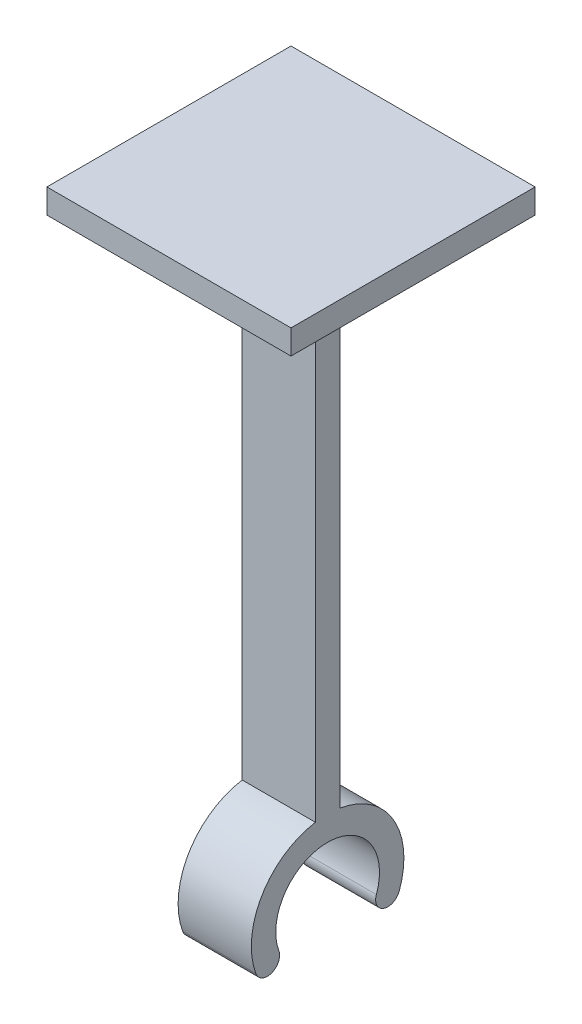
ISO-10303-21;
HEADER;
FILE_DESCRIPTION(('STEP AP214'),'2;1');
FILE_NAME('part.step','',(''),(''),'','','');
FILE_SCHEMA(('AUTOMOTIVE_DESIGN { 1 0 10303 214 1 1 1 1 }'));
ENDSEC;
DATA;
#1=APPLICATION_CONTEXT('core data for automotive mechanical design processes');
#2=APPLICATION_PROTOCOL_DEFINITION('international standard','automotive_design',2000,#1);
#3=PRODUCT_CONTEXT('',#1,'mechanical');
#4=PRODUCT('Part','Part','',(#3));
#5=PRODUCT_RELATED_PRODUCT_CATEGORY('part','',(#4));
#6=PRODUCT_DEFINITION_FORMATION('','',#4);
#7=PRODUCT_DEFINITION_CONTEXT('part definition',#1,'design');
#8=PRODUCT_DEFINITION('design','',#6,#7);
#9=PRODUCT_DEFINITION_SHAPE('','',#8);
#10=(LENGTH_UNIT() NAMED_UNIT(*) SI_UNIT(.MILLI.,.METRE.));
#11=(NAMED_UNIT(*) PLANE_ANGLE_UNIT() SI_UNIT($,.RADIAN.));
#12=(NAMED_UNIT(*) SI_UNIT($,.STERADIAN.) SOLID_ANGLE_UNIT());
#13=UNCERTAINTY_MEASURE_WITH_UNIT(LENGTH_MEASURE(1.E-05),#10,'distance_accuracy_value','');
#14=(GEOMETRIC_REPRESENTATION_CONTEXT(3) GLOBAL_UNCERTAINTY_ASSIGNED_CONTEXT((#13)) GLOBAL_UNIT_ASSIGNED_CONTEXT((#10,
#11,#12)) REPRESENTATION_CONTEXT('',''));
#15=CARTESIAN_POINT('',(0.,0.,0.));
#16=DIRECTION('',(0.,0.,1.));
#17=DIRECTION('',(1.,0.,0.));
#18=AXIS2_PLACEMENT_3D('',#15,#16,#17);
#19=CARTESIAN_POINT('',(3.,0.,0.));
#20=DIRECTION('',(-1.,0.,0.));
#21=DIRECTION('',(0.,0.,1.));
#22=AXIS2_PLACEMENT_3D('',#19,#20,#21);
#23=CYLINDRICAL_SURFACE('',#22,6.25);
#24=CARTESIAN_POINT('',(-3.,0.,0.));
#25=DIRECTION('',(1.,0.,0.));
#26=DIRECTION('',(0.,0.,-1.));
#27=AXIS2_PLACEMENT_3D('',#24,#25,#26);
#28=CIRCLE('',#27,6.25);
#29=CARTESIAN_POINT('',(-3.,-2.13762589578543,-5.87307887991193));
#30=VERTEX_POINT('',#29);
#31=CARTESIAN_POINT('',(-3.,6.16948133962653,-1.));
#32=VERTEX_POINT('',#31);
#33=EDGE_CURVE('E206',#30,#32,#28,.T.);
#34=ORIENTED_EDGE('',*,*,#33,.T.);
#35=DIRECTION('',(-1.,0.,0.));
#36=VECTOR('',#35,1.);
#37=CARTESIAN_POINT('',(3.,6.16948133962653,-1.));
#38=LINE('',#37,#36);
#39=CARTESIAN_POINT('',(3.,6.16948133962653,-1.));
#40=VERTEX_POINT('',#39);
#41=EDGE_CURVE('E65',#40,#32,#38,.T.);
#42=ORIENTED_EDGE('',*,*,#41,.F.);
#43=CARTESIAN_POINT('',(3.,0.,0.));
#44=DIRECTION('',(1.,0.,0.));
#45=DIRECTION('',(0.,0.,-1.));
#46=AXIS2_PLACEMENT_3D('',#43,#44,#45);
#47=CIRCLE('',#46,6.25);
#48=CARTESIAN_POINT('',(3.,-2.13762589578543,-5.87307887991193));
#49=VERTEX_POINT('',#48);
#50=EDGE_CURVE('E221',#49,#40,#47,.T.);
#51=ORIENTED_EDGE('',*,*,#50,.F.);
#52=DIRECTION('',(-1.,0.,0.));
#53=VECTOR('',#52,1.);
#54=CARTESIAN_POINT('',(3.,-2.13762589578543,-5.87307887991193));
#55=LINE('',#54,#53);
#56=EDGE_CURVE('E50',#49,#30,#55,.T.);
#57=ORIENTED_EDGE('',*,*,#56,.T.);
#58=EDGE_LOOP('',(#34,#42,#51,#57));
#59=FACE_BOUND('',#58,.T.);
#60=ADVANCED_FACE('F41',(#59),#23,.T.);
#61=DIRECTION('',(-1.,0.,0.));
#62=VECTOR('',#61,1.);
#63=CARTESIAN_POINT('',(3.,6.16948133962653,1.));
#64=LINE('',#63,#62);
#65=CARTESIAN_POINT('',(3.,6.16948133962653,1.));
#66=VERTEX_POINT('',#65);
#67=CARTESIAN_POINT('',(-3.,6.16948133962653,0.999999999999995));
#68=VERTEX_POINT('',#67);
#69=EDGE_CURVE('E57',#66,#68,#64,.T.);
#70=ORIENTED_EDGE('',*,*,#69,.T.);
#71=CARTESIAN_POINT('',(-3.,-2.13762589578543,5.87307887991193));
#72=VERTEX_POINT('',#71);
#73=EDGE_CURVE('E205',#68,#72,#28,.T.);
#74=ORIENTED_EDGE('',*,*,#73,.T.);
#75=DIRECTION('',(-1.,0.,0.));
#76=VECTOR('',#75,1.);
#77=CARTESIAN_POINT('',(3.,-2.13762589578543,5.87307887991193));
#78=LINE('',#77,#76);
#79=CARTESIAN_POINT('',(3.,-2.13762589578543,5.87307887991193));
#80=VERTEX_POINT('',#79);
#81=EDGE_CURVE('E233',#80,#72,#78,.T.);
#82=ORIENTED_EDGE('',*,*,#81,.F.);
#83=EDGE_CURVE('E220',#66,#80,#47,.T.);
#84=ORIENTED_EDGE('',*,*,#83,.F.);
#85=EDGE_LOOP('',(#70,#74,#82,#84));
#86=FACE_BOUND('',#85,.T.);
#87=ADVANCED_FACE('F266',(#86),#23,.T.);
#88=CARTESIAN_POINT('',(3.,0.,0.));
#89=DIRECTION('',(-1.,0.,0.));
#90=DIRECTION('',(0.,0.,1.));
#91=AXIS2_PLACEMENT_3D('',#88,#89,#90);
#92=CYLINDRICAL_SURFACE('',#91,4.25);
#93=DIRECTION('',(-1.,0.,0.));
#94=VECTOR('',#93,1.);
#95=CARTESIAN_POINT('',(3.,-1.4535856091341,3.99369363834011));
#96=LINE('',#95,#94);
#97=CARTESIAN_POINT('',(3.,-1.4535856091341,3.99369363834011));
#98=VERTEX_POINT('',#97);
#99=CARTESIAN_POINT('',(-3.,-1.4535856091341,3.99369363834011));
#100=VERTEX_POINT('',#99);
#101=EDGE_CURVE('E229',#98,#100,#96,.T.);
#102=ORIENTED_EDGE('',*,*,#101,.T.);
#103=CARTESIAN_POINT('',(-3.,0.,0.));
#104=DIRECTION('',(1.,0.,0.));
#105=DIRECTION('',(0.,0.,-1.));
#106=AXIS2_PLACEMENT_3D('',#103,#104,#105);
#107=CIRCLE('',#106,4.25);
#108=CARTESIAN_POINT('',(-3.,-1.4535856091341,-3.99369363834011));
#109=VERTEX_POINT('',#108);
#110=EDGE_CURVE('E198',#109,#100,#107,.T.);
#111=ORIENTED_EDGE('',*,*,#110,.F.);
#112=DIRECTION('',(-1.,0.,0.));
#113=VECTOR('',#112,1.);
#114=CARTESIAN_POINT('',(3.,-1.4535856091341,-3.99369363834011));
#115=LINE('',#114,#113);
#116=CARTESIAN_POINT('',(3.,-1.4535856091341,-3.99369363834011));
#117=VERTEX_POINT('',#116);
#118=EDGE_CURVE('E11',#117,#109,#115,.T.);
#119=ORIENTED_EDGE('',*,*,#118,.F.);
#120=CARTESIAN_POINT('',(3.,0.,0.));
#121=DIRECTION('',(1.,0.,0.));
#122=DIRECTION('',(0.,0.,-1.));
#123=AXIS2_PLACEMENT_3D('',#120,#121,#122);
#124=CIRCLE('',#123,4.25);
#125=EDGE_CURVE('E213',#117,#98,#124,.T.);
#126=ORIENTED_EDGE('',*,*,#125,.T.);
#127=EDGE_LOOP('',(#102,#111,#119,#126));
#128=FACE_BOUND('',#127,.T.);
#129=ADVANCED_FACE('F43',(#128),#92,.F.);
#130=CARTESIAN_POINT('',(3.,-1.79560575245977,-4.93338625912602));
#131=DIRECTION('',(-1.,0.,0.));
#132=DIRECTION('',(0.,0.,1.));
#133=AXIS2_PLACEMENT_3D('',#130,#131,#132);
#134=CYLINDRICAL_SURFACE('',#133,1.);
#135=ORIENTED_EDGE('',*,*,#118,.T.);
#136=CARTESIAN_POINT('',(-3.,-1.79560575245977,-4.93338625912602));
#137=DIRECTION('',(1.,0.,0.));
#138=DIRECTION('',(0.,0.,-1.));
#139=AXIS2_PLACEMENT_3D('',#136,#137,#138);
#140=CIRCLE('',#139,1.);
#141=EDGE_CURVE('E201',#30,#109,#140,.F.);
#142=ORIENTED_EDGE('',*,*,#141,.F.);
#143=ORIENTED_EDGE('',*,*,#56,.F.);
#144=CARTESIAN_POINT('',(3.,-1.79560575245977,-4.93338625912602));
#145=DIRECTION('',(1.,0.,0.));
#146=DIRECTION('',(0.,0.,-1.));
#147=AXIS2_PLACEMENT_3D('',#144,#145,#146);
#148=CIRCLE('',#147,1.);
#149=EDGE_CURVE('E216',#49,#117,#148,.F.);
#150=ORIENTED_EDGE('',*,*,#149,.T.);
#151=EDGE_LOOP('',(#135,#142,#143,#150));
#152=FACE_BOUND('',#151,.T.);
#153=ADVANCED_FACE('F243',(#152),#134,.T.);
#154=CARTESIAN_POINT('',(3.,-1.79560575245977,4.93338625912602));
#155=DIRECTION('',(-1.,0.,0.));
#156=DIRECTION('',(0.,0.,1.));
#157=AXIS2_PLACEMENT_3D('',#154,#155,#156);
#158=CYLINDRICAL_SURFACE('',#157,1.);
#159=ORIENTED_EDGE('',*,*,#81,.T.);
#160=CARTESIAN_POINT('',(-3.,-1.79560575245977,4.93338625912602));
#161=DIRECTION('',(1.,0.,0.));
#162=DIRECTION('',(0.,0.,-1.));
#163=AXIS2_PLACEMENT_3D('',#160,#161,#162);
#164=CIRCLE('',#163,1.);
#165=EDGE_CURVE('E209',#72,#100,#164,.T.);
#166=ORIENTED_EDGE('',*,*,#165,.T.);
#167=ORIENTED_EDGE('',*,*,#101,.F.);
#168=CARTESIAN_POINT('',(3.,-1.79560575245977,4.93338625912602));
#169=DIRECTION('',(1.,0.,0.));
#170=DIRECTION('',(0.,0.,-1.));
#171=AXIS2_PLACEMENT_3D('',#168,#169,#170);
#172=CIRCLE('',#171,1.);
#173=EDGE_CURVE('E225',#80,#98,#172,.T.);
#174=ORIENTED_EDGE('',*,*,#173,.F.);
#175=EDGE_LOOP('',(#159,#166,#167,#174));
#176=FACE_BOUND('',#175,.T.);
#177=ADVANCED_FACE('F264',(#176),#158,.T.);
#178=CARTESIAN_POINT('',(3.,0.,0.));
#179=DIRECTION('',(1.,0.,0.));
#180=DIRECTION('',(0.,0.,-1.));
#181=AXIS2_PLACEMENT_3D('',#178,#179,#180);
#182=PLANE('',#181);
#183=ORIENTED_EDGE('',*,*,#173,.T.);
#184=ORIENTED_EDGE('',*,*,#125,.F.);
#185=ORIENTED_EDGE('',*,*,#149,.F.);
#186=ORIENTED_EDGE('',*,*,#50,.T.);
#187=DIRECTION('',(0.,1.,0.));
#188=VECTOR('',#187,1.);
#189=CARTESIAN_POINT('',(3.,0.,-1.));
#190=LINE('',#189,#188);
#191=CARTESIAN_POINT('',(3.,47.25,-1.));
#192=VERTEX_POINT('',#191);
#193=EDGE_CURVE('E176',#40,#192,#190,.T.);
#194=ORIENTED_EDGE('',*,*,#193,.T.);
#195=DIRECTION('',(0.,0.,-1.));
#196=VECTOR('',#195,1.);
#197=CARTESIAN_POINT('',(3.,47.25,0.));
#198=LINE('',#197,#196);
#199=CARTESIAN_POINT('',(3.,47.25,1.));
#200=VERTEX_POINT('',#199);
#201=EDGE_CURVE('E180',#200,#192,#198,.T.);
#202=ORIENTED_EDGE('',*,*,#201,.F.);
#203=DIRECTION('',(0.,1.,0.));
#204=VECTOR('',#203,1.);
#205=CARTESIAN_POINT('',(3.,0.,1.));
#206=LINE('',#205,#204);
#207=EDGE_CURVE('E184',#66,#200,#206,.T.);
#208=ORIENTED_EDGE('',*,*,#207,.F.);
#209=ORIENTED_EDGE('',*,*,#83,.T.);
#210=EDGE_LOOP('',(#183,#184,#185,#186,#194,#202,#208,#209));
#211=FACE_BOUND('',#210,.T.);
#212=ADVANCED_FACE('F257',(#211),#182,.T.);
#213=CARTESIAN_POINT('',(-3.,0.,0.));
#214=DIRECTION('',(1.,0.,0.));
#215=DIRECTION('',(0.,0.,-1.));
#216=AXIS2_PLACEMENT_3D('',#213,#214,#215);
#217=PLANE('',#216);
#218=ORIENTED_EDGE('',*,*,#110,.T.);
#219=ORIENTED_EDGE('',*,*,#165,.F.);
#220=ORIENTED_EDGE('',*,*,#73,.F.);
#221=DIRECTION('',(0.,-1.,0.));
#222=VECTOR('',#221,1.);
#223=CARTESIAN_POINT('',(-3.,0.,0.999999999999994));
#224=LINE('',#223,#222);
#225=CARTESIAN_POINT('',(-3.,47.25,1.));
#226=VERTEX_POINT('',#225);
#227=EDGE_CURVE('E172',#226,#68,#224,.T.);
#228=ORIENTED_EDGE('',*,*,#227,.F.);
#229=DIRECTION('',(0.,0.,-1.));
#230=VECTOR('',#229,1.);
#231=CARTESIAN_POINT('',(-3.,47.25,0.));
#232=LINE('',#231,#230);
#233=CARTESIAN_POINT('',(-3.,47.25,-1.));
#234=VERTEX_POINT('',#233);
#235=EDGE_CURVE('E164',#226,#234,#232,.T.);
#236=ORIENTED_EDGE('',*,*,#235,.T.);
#237=DIRECTION('',(0.,-1.,0.));
#238=VECTOR('',#237,1.);
#239=CARTESIAN_POINT('',(-3.,0.,-1.00000000000001));
#240=LINE('',#239,#238);
#241=EDGE_CURVE('E159',#234,#32,#240,.T.);
#242=ORIENTED_EDGE('',*,*,#241,.T.);
#243=ORIENTED_EDGE('',*,*,#33,.F.);
#244=ORIENTED_EDGE('',*,*,#141,.T.);
#245=EDGE_LOOP('',(#218,#219,#220,#228,#236,#242,#243,#244));
#246=FACE_BOUND('',#245,.T.);
#247=ADVANCED_FACE('F246',(#246),#217,.F.);
#248=CARTESIAN_POINT('',(3.,0.,-1.));
#249=DIRECTION('',(0.,0.,1.));
#250=DIRECTION('',(1.,0.,0.));
#251=AXIS2_PLACEMENT_3D('',#248,#249,#250);
#252=PLANE('',#251);
#253=ORIENTED_EDGE('',*,*,#193,.F.);
#254=ORIENTED_EDGE('',*,*,#41,.T.);
#255=ORIENTED_EDGE('',*,*,#241,.F.);
#256=DIRECTION('',(-1.,0.,0.));
#257=VECTOR('',#256,1.);
#258=CARTESIAN_POINT('',(3.,47.25,-1.));
#259=LINE('',#258,#257);
#260=EDGE_CURVE('E190',#192,#234,#259,.T.);
#261=ORIENTED_EDGE('',*,*,#260,.F.);
#262=EDGE_LOOP('',(#253,#254,#255,#261));
#263=FACE_BOUND('',#262,.T.);
#264=ADVANCED_FACE('F249',(#263),#252,.F.);
#265=CARTESIAN_POINT('',(3.,0.,1.));
#266=DIRECTION('',(0.,0.,1.));
#267=DIRECTION('',(1.,0.,0.));
#268=AXIS2_PLACEMENT_3D('',#265,#266,#267);
#269=PLANE('',#268);
#270=ORIENTED_EDGE('',*,*,#69,.F.);
#271=ORIENTED_EDGE('',*,*,#207,.T.);
#272=DIRECTION('',(-1.,0.,0.));
#273=VECTOR('',#272,1.);
#274=CARTESIAN_POINT('',(3.,47.25,1.));
#275=LINE('',#274,#273);
#276=EDGE_CURVE('E187',#200,#226,#275,.T.);
#277=ORIENTED_EDGE('',*,*,#276,.T.);
#278=ORIENTED_EDGE('',*,*,#227,.T.);
#279=EDGE_LOOP('',(#270,#271,#277,#278));
#280=FACE_BOUND('',#279,.T.);
#281=ADVANCED_FACE('F270',(#280),#269,.T.);
#282=CARTESIAN_POINT('',(10.,49.25,10.));
#283=DIRECTION('',(-1.,0.,0.));
#284=DIRECTION('',(0.,0.,1.));
#285=AXIS2_PLACEMENT_3D('',#282,#283,#284);
#286=PLANE('',#285);
#287=DIRECTION('',(0.,0.,-1.));
#288=VECTOR('',#287,1.);
#289=CARTESIAN_POINT('',(10.,47.25,10.));
#290=LINE('',#289,#288);
#291=CARTESIAN_POINT('',(10.,47.25,10.));
#292=VERTEX_POINT('',#291);
#293=CARTESIAN_POINT('',(10.,47.25,-10.));
#294=VERTEX_POINT('',#293);
#295=EDGE_CURVE('E157',#292,#294,#290,.T.);
#296=ORIENTED_EDGE('',*,*,#295,.T.);
#297=DIRECTION('',(0.,-1.,0.));
#298=VECTOR('',#297,1.);
#299=CARTESIAN_POINT('',(10.,49.25,-10.));
#300=LINE('',#299,#298);
#301=CARTESIAN_POINT('',(10.,49.25,-10.));
#302=VERTEX_POINT('',#301);
#303=EDGE_CURVE('E135',#302,#294,#300,.T.);
#304=ORIENTED_EDGE('',*,*,#303,.F.);
#305=DIRECTION('',(0.,0.,-1.));
#306=VECTOR('',#305,1.);
#307=CARTESIAN_POINT('',(10.,49.25,10.));
#308=LINE('',#307,#306);
#309=CARTESIAN_POINT('',(10.,49.25,10.));
#310=VERTEX_POINT('',#309);
#311=EDGE_CURVE('E143',#310,#302,#308,.T.);
#312=ORIENTED_EDGE('',*,*,#311,.F.);
#313=DIRECTION('',(0.,-1.,0.));
#314=VECTOR('',#313,1.);
#315=CARTESIAN_POINT('',(10.,49.25,10.));
#316=LINE('',#315,#314);
#317=EDGE_CURVE('E394',#310,#292,#316,.T.);
#318=ORIENTED_EDGE('',*,*,#317,.T.);
#319=EDGE_LOOP('',(#296,#304,#312,#318));
#320=FACE_BOUND('',#319,.T.);
#321=ADVANCED_FACE('F155',(#320),#286,.F.);
#322=CARTESIAN_POINT('',(-10.,49.25,-10.));
#323=DIRECTION('',(0.,0.,1.));
#324=DIRECTION('',(1.,0.,0.));
#325=AXIS2_PLACEMENT_3D('',#322,#323,#324);
#326=PLANE('',#325);
#327=DIRECTION('',(-1.,0.,0.));
#328=VECTOR('',#327,1.);
#329=CARTESIAN_POINT('',(-10.,47.25,-10.));
#330=LINE('',#329,#328);
#331=CARTESIAN_POINT('',(-10.,47.25,-10.));
#332=VERTEX_POINT('',#331);
#333=EDGE_CURVE('E402',#294,#332,#330,.T.);
#334=ORIENTED_EDGE('',*,*,#333,.T.);
#335=DIRECTION('',(0.,-1.,0.));
#336=VECTOR('',#335,1.);
#337=CARTESIAN_POINT('',(-10.,49.25,-10.));
#338=LINE('',#337,#336);
#339=CARTESIAN_POINT('',(-10.,49.25,-10.));
#340=VERTEX_POINT('',#339);
#341=EDGE_CURVE('E138',#340,#332,#338,.T.);
#342=ORIENTED_EDGE('',*,*,#341,.F.);
#343=DIRECTION('',(-1.,0.,0.));
#344=VECTOR('',#343,1.);
#345=CARTESIAN_POINT('',(-10.,49.25,-10.));
#346=LINE('',#345,#344);
#347=EDGE_CURVE('E131',#302,#340,#346,.T.);
#348=ORIENTED_EDGE('',*,*,#347,.F.);
#349=ORIENTED_EDGE('',*,*,#303,.T.);
#350=EDGE_LOOP('',(#334,#342,#348,#349));
#351=FACE_BOUND('',#350,.T.);
#352=ADVANCED_FACE('F133',(#351),#326,.F.);
#353=CARTESIAN_POINT('',(-10.,49.25,10.));
#354=DIRECTION('',(1.,0.,0.));
#355=DIRECTION('',(0.,0.,-1.));
#356=AXIS2_PLACEMENT_3D('',#353,#354,#355);
#357=PLANE('',#356);
#358=DIRECTION('',(0.,0.,1.));
#359=VECTOR('',#358,1.);
#360=CARTESIAN_POINT('',(-10.,47.25,10.));
#361=LINE('',#360,#359);
#362=CARTESIAN_POINT('',(-10.,47.25,10.));
#363=VERTEX_POINT('',#362);
#364=EDGE_CURVE('E398',#332,#363,#361,.T.);
#365=ORIENTED_EDGE('',*,*,#364,.T.);
#366=DIRECTION('',(0.,-1.,0.));
#367=VECTOR('',#366,1.);
#368=CARTESIAN_POINT('',(-10.,49.25,10.));
#369=LINE('',#368,#367);
#370=CARTESIAN_POINT('',(-10.,49.25,10.));
#371=VERTEX_POINT('',#370);
#372=EDGE_CURVE('E166',#371,#363,#369,.T.);
#373=ORIENTED_EDGE('',*,*,#372,.F.);
#374=DIRECTION('',(0.,0.,1.));
#375=VECTOR('',#374,1.);
#376=CARTESIAN_POINT('',(-10.,49.25,10.));
#377=LINE('',#376,#375);
#378=EDGE_CURVE('E142',#340,#371,#377,.T.);
#379=ORIENTED_EDGE('',*,*,#378,.F.);
#380=ORIENTED_EDGE('',*,*,#341,.T.);
#381=EDGE_LOOP('',(#365,#373,#379,#380));
#382=FACE_BOUND('',#381,.T.);
#383=ADVANCED_FACE('F353',(#382),#357,.F.);
#384=CARTESIAN_POINT('',(-10.,49.25,10.));
#385=DIRECTION('',(0.,0.,-1.));
#386=DIRECTION('',(-1.,0.,0.));
#387=AXIS2_PLACEMENT_3D('',#384,#385,#386);
#388=PLANE('',#387);
#389=DIRECTION('',(1.,0.,0.));
#390=VECTOR('',#389,1.);
#391=CARTESIAN_POINT('',(-10.,47.25,10.));
#392=LINE('',#391,#390);
#393=EDGE_CURVE('E153',#363,#292,#392,.T.);
#394=ORIENTED_EDGE('',*,*,#393,.T.);
#395=ORIENTED_EDGE('',*,*,#317,.F.);
#396=DIRECTION('',(1.,0.,0.));
#397=VECTOR('',#396,1.);
#398=CARTESIAN_POINT('',(-10.,49.25,10.));
#399=LINE('',#398,#397);
#400=EDGE_CURVE('E148',#371,#310,#399,.T.);
#401=ORIENTED_EDGE('',*,*,#400,.F.);
#402=ORIENTED_EDGE('',*,*,#372,.T.);
#403=EDGE_LOOP('',(#394,#395,#401,#402));
#404=FACE_BOUND('',#403,.T.);
#405=ADVANCED_FACE('F362',(#404),#388,.F.);
#406=CARTESIAN_POINT('',(0.,49.25,0.));
#407=DIRECTION('',(0.,-1.,0.));
#408=DIRECTION('',(0.,0.,-1.));
#409=AXIS2_PLACEMENT_3D('',#406,#407,#408);
#410=PLANE('',#409);
#411=ORIENTED_EDGE('',*,*,#311,.T.);
#412=ORIENTED_EDGE('',*,*,#347,.T.);
#413=ORIENTED_EDGE('',*,*,#378,.T.);
#414=ORIENTED_EDGE('',*,*,#400,.T.);
#415=EDGE_LOOP('',(#411,#412,#413,#414));
#416=FACE_BOUND('',#415,.T.);
#417=ADVANCED_FACE('F146',(#416),#410,.F.);
#418=CARTESIAN_POINT('',(0.,47.25,0.));
#419=DIRECTION('',(0.,-1.,0.));
#420=DIRECTION('',(0.,0.,-1.));
#421=AXIS2_PLACEMENT_3D('',#418,#419,#420);
#422=PLANE('',#421);
#423=ORIENTED_EDGE('',*,*,#201,.T.);
#424=ORIENTED_EDGE('',*,*,#260,.T.);
#425=ORIENTED_EDGE('',*,*,#235,.F.);
#426=ORIENTED_EDGE('',*,*,#276,.F.);
#427=EDGE_LOOP('',(#423,#424,#425,#426));
#428=FACE_BOUND('',#427,.T.);
#429=ORIENTED_EDGE('',*,*,#295,.F.);
#430=ORIENTED_EDGE('',*,*,#393,.F.);
#431=ORIENTED_EDGE('',*,*,#364,.F.);
#432=ORIENTED_EDGE('',*,*,#333,.F.);
#433=EDGE_LOOP('',(#429,#430,#431,#432));
#434=FACE_BOUND('',#433,.T.);
#435=ADVANCED_FACE('F251',(#428,#434),#422,.T.);
#436=CLOSED_SHELL('',(#60,#87,#129,#153,#177,#212,#247,#264,#281,#321,#352,#383,#405,#417,#435));
#437=MANIFOLD_SOLID_BREP('B2',#436);
#438=ADVANCED_BREP_SHAPE_REPRESENTATION('',(#18,#437),#14);
#439=SHAPE_DEFINITION_REPRESENTATION(#9,#438);
ENDSEC;
END-ISO-10303-21;
